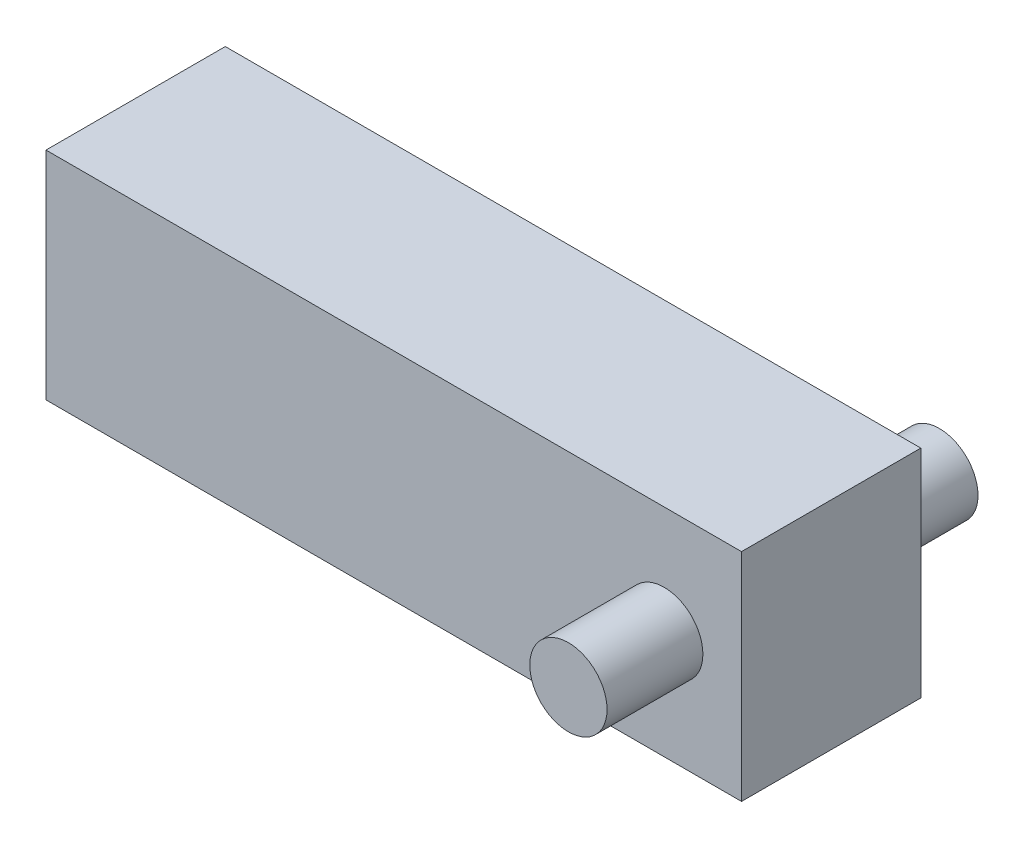
ISO-10303-21;
HEADER;
FILE_DESCRIPTION(('STEP AP214'),'2;1');
FILE_NAME('part.step','',(''),(''),'','','');
FILE_SCHEMA(('AUTOMOTIVE_DESIGN { 1 0 10303 214 1 1 1 1 }'));
ENDSEC;
DATA;
#1=APPLICATION_CONTEXT('core data for automotive mechanical design processes');
#2=APPLICATION_PROTOCOL_DEFINITION('international standard','automotive_design',2000,#1);
#3=PRODUCT_CONTEXT('',#1,'mechanical');
#4=PRODUCT('Part','Part','',(#3));
#5=PRODUCT_RELATED_PRODUCT_CATEGORY('part','',(#4));
#6=PRODUCT_DEFINITION_FORMATION('','',#4);
#7=PRODUCT_DEFINITION_CONTEXT('part definition',#1,'design');
#8=PRODUCT_DEFINITION('design','',#6,#7);
#9=PRODUCT_DEFINITION_SHAPE('','',#8);
#10=(LENGTH_UNIT() NAMED_UNIT(*) SI_UNIT(.MILLI.,.METRE.));
#11=(NAMED_UNIT(*) PLANE_ANGLE_UNIT() SI_UNIT($,.RADIAN.));
#12=(NAMED_UNIT(*) SI_UNIT($,.STERADIAN.) SOLID_ANGLE_UNIT());
#13=UNCERTAINTY_MEASURE_WITH_UNIT(LENGTH_MEASURE(1.E-05),#10,'distance_accuracy_value','');
#14=(GEOMETRIC_REPRESENTATION_CONTEXT(3) GLOBAL_UNCERTAINTY_ASSIGNED_CONTEXT((#13)) GLOBAL_UNIT_ASSIGNED_CONTEXT((#10,
#11,#12)) REPRESENTATION_CONTEXT('',''));
#15=CARTESIAN_POINT('',(0.,0.,0.));
#16=DIRECTION('',(0.,0.,1.));
#17=DIRECTION('',(1.,0.,0.));
#18=AXIS2_PLACEMENT_3D('',#15,#16,#17);
#19=CARTESIAN_POINT('',(-12.7,-4.445,-3.683));
#20=DIRECTION('',(-1.,0.,0.));
#21=DIRECTION('',(0.,0.,1.));
#22=AXIS2_PLACEMENT_3D('',#19,#20,#21);
#23=PLANE('',#22);
#24=DIRECTION('',(0.,0.,1.));
#25=VECTOR('',#24,1.);
#26=CARTESIAN_POINT('',(-12.7,-4.445,-3.683));
#27=LINE('',#26,#25);
#28=CARTESIAN_POINT('',(-12.7,-4.445,-3.683));
#29=VERTEX_POINT('',#28);
#30=CARTESIAN_POINT('',(-12.7,-4.445,3.683));
#31=VERTEX_POINT('',#30);
#32=EDGE_CURVE('E73',#29,#31,#27,.T.);
#33=ORIENTED_EDGE('',*,*,#32,.T.);
#34=DIRECTION('',(0.,-1.,0.));
#35=VECTOR('',#34,1.);
#36=CARTESIAN_POINT('',(-12.7,-4.445,3.683));
#37=LINE('',#36,#35);
#38=CARTESIAN_POINT('',(-12.7,4.445,3.683));
#39=VERTEX_POINT('',#38);
#40=EDGE_CURVE('E76',#39,#31,#37,.T.);
#41=ORIENTED_EDGE('',*,*,#40,.F.);
#42=DIRECTION('',(0.,0.,1.));
#43=VECTOR('',#42,1.);
#44=CARTESIAN_POINT('',(-12.7,4.445,-3.683));
#45=LINE('',#44,#43);
#46=CARTESIAN_POINT('',(-12.7,4.445,-3.683));
#47=VERTEX_POINT('',#46);
#48=EDGE_CURVE('E41',#47,#39,#45,.T.);
#49=ORIENTED_EDGE('',*,*,#48,.F.);
#50=DIRECTION('',(0.,-1.,0.));
#51=VECTOR('',#50,1.);
#52=CARTESIAN_POINT('',(-12.7,-4.445,-3.683));
#53=LINE('',#52,#51);
#54=EDGE_CURVE('E78',#47,#29,#53,.T.);
#55=ORIENTED_EDGE('',*,*,#54,.T.);
#56=EDGE_LOOP('',(#33,#41,#49,#55));
#57=FACE_BOUND('',#56,.T.);
#58=ADVANCED_FACE('F33',(#57),#23,.T.);
#59=CARTESIAN_POINT('',(-12.7,4.445,-3.683));
#60=DIRECTION('',(0.,1.,0.));
#61=DIRECTION('',(0.,0.,1.));
#62=AXIS2_PLACEMENT_3D('',#59,#60,#61);
#63=PLANE('',#62);
#64=ORIENTED_EDGE('',*,*,#48,.T.);
#65=DIRECTION('',(-1.,0.,0.));
#66=VECTOR('',#65,1.);
#67=CARTESIAN_POINT('',(12.7,4.445,3.683));
#68=LINE('',#67,#66);
#69=CARTESIAN_POINT('',(15.875,4.445,3.683));
#70=VERTEX_POINT('',#69);
#71=EDGE_CURVE('E93',#70,#39,#68,.T.);
#72=ORIENTED_EDGE('',*,*,#71,.F.);
#73=DIRECTION('',(0.,0.,1.));
#74=VECTOR('',#73,1.);
#75=CARTESIAN_POINT('',(15.875,4.445,-3.683));
#76=LINE('',#75,#74);
#77=CARTESIAN_POINT('',(15.875,4.445,-3.683));
#78=VERTEX_POINT('',#77);
#79=EDGE_CURVE('E54',#78,#70,#76,.T.);
#80=ORIENTED_EDGE('',*,*,#79,.F.);
#81=DIRECTION('',(-1.,0.,0.));
#82=VECTOR('',#81,1.);
#83=CARTESIAN_POINT('',(12.7,4.445,-3.683));
#84=LINE('',#83,#82);
#85=EDGE_CURVE('E49',#78,#47,#84,.T.);
#86=ORIENTED_EDGE('',*,*,#85,.T.);
#87=EDGE_LOOP('',(#64,#72,#80,#86));
#88=FACE_BOUND('',#87,.T.);
#89=ADVANCED_FACE('F113',(#88),#63,.T.);
#90=CARTESIAN_POINT('',(15.875,4.445,-3.683));
#91=DIRECTION('',(1.,0.,0.));
#92=DIRECTION('',(0.,0.,-1.));
#93=AXIS2_PLACEMENT_3D('',#90,#91,#92);
#94=PLANE('',#93);
#95=ORIENTED_EDGE('',*,*,#79,.T.);
#96=DIRECTION('',(0.,1.,0.));
#97=VECTOR('',#96,1.);
#98=CARTESIAN_POINT('',(15.875,4.445,3.683));
#99=LINE('',#98,#97);
#100=CARTESIAN_POINT('',(15.875,-4.445,3.683));
#101=VERTEX_POINT('',#100);
#102=EDGE_CURVE('E89',#101,#70,#99,.T.);
#103=ORIENTED_EDGE('',*,*,#102,.F.);
#104=DIRECTION('',(0.,0.,1.));
#105=VECTOR('',#104,1.);
#106=CARTESIAN_POINT('',(15.875,-4.445,-3.683));
#107=LINE('',#106,#105);
#108=CARTESIAN_POINT('',(15.875,-4.445,-3.683));
#109=VERTEX_POINT('',#108);
#110=EDGE_CURVE('E81',#109,#101,#107,.T.);
#111=ORIENTED_EDGE('',*,*,#110,.F.);
#112=DIRECTION('',(0.,1.,0.));
#113=VECTOR('',#112,1.);
#114=CARTESIAN_POINT('',(15.875,4.445,-3.683));
#115=LINE('',#114,#113);
#116=EDGE_CURVE('E104',#109,#78,#115,.T.);
#117=ORIENTED_EDGE('',*,*,#116,.T.);
#118=EDGE_LOOP('',(#95,#103,#111,#117));
#119=FACE_BOUND('',#118,.T.);
#120=ADVANCED_FACE('F111',(#119),#94,.T.);
#121=CARTESIAN_POINT('',(15.875,-4.445,-3.683));
#122=DIRECTION('',(0.,-1.,0.));
#123=DIRECTION('',(0.,0.,-1.));
#124=AXIS2_PLACEMENT_3D('',#121,#122,#123);
#125=PLANE('',#124);
#126=ORIENTED_EDGE('',*,*,#110,.T.);
#127=DIRECTION('',(1.,0.,0.));
#128=VECTOR('',#127,1.);
#129=CARTESIAN_POINT('',(12.7,-4.445,3.683));
#130=LINE('',#129,#128);
#131=EDGE_CURVE('E83',#31,#101,#130,.T.);
#132=ORIENTED_EDGE('',*,*,#131,.F.);
#133=ORIENTED_EDGE('',*,*,#32,.F.);
#134=DIRECTION('',(1.,0.,0.));
#135=VECTOR('',#134,1.);
#136=CARTESIAN_POINT('',(12.7,-4.445,-3.683));
#137=LINE('',#136,#135);
#138=EDGE_CURVE('E102',#29,#109,#137,.T.);
#139=ORIENTED_EDGE('',*,*,#138,.T.);
#140=EDGE_LOOP('',(#126,#132,#133,#139));
#141=FACE_BOUND('',#140,.T.);
#142=ADVANCED_FACE('F84',(#141),#125,.T.);
#143=CARTESIAN_POINT('',(-12.7,4.445,-3.683));
#144=DIRECTION('',(0.,0.,-1.));
#145=DIRECTION('',(-1.,0.,0.));
#146=AXIS2_PLACEMENT_3D('',#143,#144,#145);
#147=PLANE('',#146);
#148=CARTESIAN_POINT('',(12.7,0.,-3.683));
#149=DIRECTION('',(0.,0.,-1.));
#150=DIRECTION('',(-1.,0.,0.));
#151=AXIS2_PLACEMENT_3D('',#148,#149,#150);
#152=CIRCLE('',#151,1.5875);
#153=CARTESIAN_POINT('',(14.2875,0.,-3.683));
#154=VERTEX_POINT('',#153);
#155=EDGE_CURVE('E11',#154,#154,#152,.T.);
#156=ORIENTED_EDGE('',*,*,#155,.F.);
#157=EDGE_LOOP('',(#156));
#158=FACE_BOUND('',#157,.T.);
#159=ORIENTED_EDGE('',*,*,#54,.F.);
#160=ORIENTED_EDGE('',*,*,#85,.F.);
#161=ORIENTED_EDGE('',*,*,#116,.F.);
#162=ORIENTED_EDGE('',*,*,#138,.F.);
#163=EDGE_LOOP('',(#159,#160,#161,#162));
#164=FACE_BOUND('',#163,.T.);
#165=ADVANCED_FACE('F115',(#158,#164),#147,.T.);
#166=CARTESIAN_POINT('',(-12.7,4.445,3.683));
#167=DIRECTION('',(0.,0.,-1.));
#168=DIRECTION('',(-1.,0.,0.));
#169=AXIS2_PLACEMENT_3D('',#166,#167,#168);
#170=PLANE('',#169);
#171=CARTESIAN_POINT('',(12.7,0.,3.683));
#172=DIRECTION('',(0.,0.,-1.));
#173=DIRECTION('',(-1.,0.,0.));
#174=AXIS2_PLACEMENT_3D('',#171,#172,#173);
#175=CIRCLE('',#174,1.5875);
#176=CARTESIAN_POINT('',(14.2875,0.,3.683));
#177=VERTEX_POINT('',#176);
#178=EDGE_CURVE('E36',#177,#177,#175,.T.);
#179=ORIENTED_EDGE('',*,*,#178,.T.);
#180=EDGE_LOOP('',(#179));
#181=FACE_BOUND('',#180,.T.);
#182=ORIENTED_EDGE('',*,*,#40,.T.);
#183=ORIENTED_EDGE('',*,*,#131,.T.);
#184=ORIENTED_EDGE('',*,*,#102,.T.);
#185=ORIENTED_EDGE('',*,*,#71,.T.);
#186=EDGE_LOOP('',(#182,#183,#184,#185));
#187=FACE_BOUND('',#186,.T.);
#188=ADVANCED_FACE('F92',(#181,#187),#170,.F.);
#189=CARTESIAN_POINT('',(12.7,0.,7.62));
#190=DIRECTION('',(0.,0.,1.));
#191=DIRECTION('',(1.,0.,0.));
#192=AXIS2_PLACEMENT_3D('',#189,#190,#191);
#193=PLANE('',#192);
#194=CARTESIAN_POINT('',(12.7,0.,7.62));
#195=DIRECTION('',(0.,0.,1.));
#196=DIRECTION('',(1.,0.,0.));
#197=AXIS2_PLACEMENT_3D('',#194,#195,#196);
#198=CIRCLE('',#197,1.5875);
#199=CARTESIAN_POINT('',(14.2875,0.,7.62));
#200=VERTEX_POINT('',#199);
#201=EDGE_CURVE('E198',#200,#200,#198,.T.);
#202=ORIENTED_EDGE('',*,*,#201,.T.);
#203=EDGE_LOOP('',(#202));
#204=FACE_BOUND('',#203,.T.);
#205=ADVANCED_FACE('F123',(#204),#193,.T.);
#206=CARTESIAN_POINT('',(12.7,0.,-7.62));
#207=DIRECTION('',(0.,0.,1.));
#208=DIRECTION('',(1.,0.,0.));
#209=AXIS2_PLACEMENT_3D('',#206,#207,#208);
#210=CYLINDRICAL_SURFACE('',#209,1.5875);
#211=CARTESIAN_POINT('',(14.2875,0.,7.62));
#212=CARTESIAN_POINT('',(14.2875,0.,7.57898958333333));
#213=CARTESIAN_POINT('',(14.2875,0.,7.53797916666667));
#214=CARTESIAN_POINT('',(14.2875,0.,7.45595833333333));
#215=CARTESIAN_POINT('',(14.2875,0.,7.41494791666667));
#216=CARTESIAN_POINT('',(14.2875,0.,7.33292708333333));
#217=CARTESIAN_POINT('',(14.2875,0.,7.29191666666667));
#218=CARTESIAN_POINT('',(14.2875,0.,7.20989583333333));
#219=CARTESIAN_POINT('',(14.2875,0.,7.16888541666667));
#220=CARTESIAN_POINT('',(14.2875,0.,7.08686458333333));
#221=CARTESIAN_POINT('',(14.2875,0.,7.04585416666667));
#222=CARTESIAN_POINT('',(14.2875,0.,6.96383333333333));
#223=CARTESIAN_POINT('',(14.2875,0.,6.92282291666667));
#224=CARTESIAN_POINT('',(14.2875,0.,6.84080208333333));
#225=CARTESIAN_POINT('',(14.2875,0.,6.79979166666667));
#226=CARTESIAN_POINT('',(14.2875,0.,6.71777083333333));
#227=CARTESIAN_POINT('',(14.2875,0.,6.67676041666667));
#228=CARTESIAN_POINT('',(14.2875,0.,6.59473958333333));
#229=CARTESIAN_POINT('',(14.2875,0.,6.55372916666667));
#230=CARTESIAN_POINT('',(14.2875,0.,6.47170833333333));
#231=CARTESIAN_POINT('',(14.2875,0.,6.43069791666667));
#232=CARTESIAN_POINT('',(14.2875,0.,6.34867708333333));
#233=CARTESIAN_POINT('',(14.2875,0.,6.30766666666667));
#234=CARTESIAN_POINT('',(14.2875,0.,6.22564583333333));
#235=CARTESIAN_POINT('',(14.2875,0.,6.18463541666667));
#236=CARTESIAN_POINT('',(14.2875,0.,6.10261458333333));
#237=CARTESIAN_POINT('',(14.2875,0.,6.06160416666667));
#238=CARTESIAN_POINT('',(14.2875,0.,5.97958333333333));
#239=CARTESIAN_POINT('',(14.2875,0.,5.93857291666667));
#240=CARTESIAN_POINT('',(14.2875,0.,5.85655208333333));
#241=CARTESIAN_POINT('',(14.2875,0.,5.81554166666667));
#242=CARTESIAN_POINT('',(14.2875,0.,5.73352083333333));
#243=CARTESIAN_POINT('',(14.2875,0.,5.69251041666667));
#244=CARTESIAN_POINT('',(14.2875,0.,5.61048958333333));
#245=CARTESIAN_POINT('',(14.2875,0.,5.56947916666667));
#246=CARTESIAN_POINT('',(14.2875,0.,5.48745833333333));
#247=CARTESIAN_POINT('',(14.2875,0.,5.44644791666667));
#248=CARTESIAN_POINT('',(14.2875,0.,5.36442708333333));
#249=CARTESIAN_POINT('',(14.2875,0.,5.32341666666667));
#250=CARTESIAN_POINT('',(14.2875,0.,5.24139583333333));
#251=CARTESIAN_POINT('',(14.2875,0.,5.20038541666667));
#252=CARTESIAN_POINT('',(14.2875,0.,5.11836458333333));
#253=CARTESIAN_POINT('',(14.2875,0.,5.07735416666667));
#254=CARTESIAN_POINT('',(14.2875,0.,4.99533333333333));
#255=CARTESIAN_POINT('',(14.2875,0.,4.95432291666667));
#256=CARTESIAN_POINT('',(14.2875,0.,4.87230208333333));
#257=CARTESIAN_POINT('',(14.2875,0.,4.83129166666667));
#258=CARTESIAN_POINT('',(14.2875,0.,4.74927083333333));
#259=CARTESIAN_POINT('',(14.2875,0.,4.70826041666666));
#260=CARTESIAN_POINT('',(14.2875,0.,4.62623958333333));
#261=CARTESIAN_POINT('',(14.2875,0.,4.58522916666667));
#262=CARTESIAN_POINT('',(14.2875,0.,4.50320833333333));
#263=CARTESIAN_POINT('',(14.2875,0.,4.46219791666667));
#264=CARTESIAN_POINT('',(14.2875,0.,4.38017708333333));
#265=CARTESIAN_POINT('',(14.2875,0.,4.33916666666667));
#266=CARTESIAN_POINT('',(14.2875,0.,4.25714583333333));
#267=CARTESIAN_POINT('',(14.2875,0.,4.21613541666667));
#268=CARTESIAN_POINT('',(14.2875,0.,4.13411458333333));
#269=CARTESIAN_POINT('',(14.2875,0.,4.09310416666667));
#270=CARTESIAN_POINT('',(14.2875,0.,4.01108333333333));
#271=CARTESIAN_POINT('',(14.2875,0.,3.97007291666667));
#272=CARTESIAN_POINT('',(14.2875,0.,3.88805208333333));
#273=CARTESIAN_POINT('',(14.2875,0.,3.84704166666667));
#274=CARTESIAN_POINT('',(14.2875,0.,3.76502083333333));
#275=CARTESIAN_POINT('',(14.2875,0.,3.72401041666667));
#276=CARTESIAN_POINT('',(14.2875,0.,3.683));
#277=B_SPLINE_CURVE_WITH_KNOTS('',3,(#211,#212,#213,#214,#215,#216,#217,#218,#219,#220,#221,
#222,#223,#224,#225,#226,#227,#228,#229,#230,#231,#232,#233,#234,#235,#236,#237,#238,#239,#240,
#241,#242,#243,#244,#245,#246,#247,#248,#249,#250,#251,#252,#253,#254,#255,#256,#257,#258,#259,
#260,#261,#262,#263,#264,#265,#266,#267,#268,#269,#270,#271,#272,#273,#274,#275,#276),
.UNSPECIFIED.,.F.,.F.,(4,2,2,2,2,2,2,2,2,2,2,2,2,2,2,2,2,2,2,2,2,2,2,2,2,2,2,2,2,2,2,2,4),(0.,
0.123031250000001,0.2460625,0.36909375,0.492124999999999,0.61515625,0.738187499999999,
0.86121875,0.984249999999999,1.10728125,1.2303125,1.35334375,1.476375,1.59940625,1.7224375,
1.84546875,1.9685,2.09153125,2.2145625,2.33759375,2.460625,2.58365625,2.7066875,2.82971875,
2.95275,3.07578125,3.1988125,3.32184375,3.444875,3.56790625,3.6909375,3.81396875,3.937),.UNSPECIFIED.);
#278=EDGE_CURVE('BSEAM162',#200,#177,#277,.T.);
#279=ORIENTED_EDGE('',*,*,#201,.F.);
#280=ORIENTED_EDGE('',*,*,#178,.F.);
#281=ORIENTED_EDGE('',*,*,#278,.T.);
#282=ORIENTED_EDGE('',*,*,#278,.F.);
#283=EDGE_LOOP('',(#279,#281,#280,#282));
#284=FACE_BOUND('',#283,.T.);
#285=ADVANCED_FACE('F162',(#284),#210,.T.);
#286=CARTESIAN_POINT('',(12.7,0.,-7.62));
#287=DIRECTION('',(0.,0.,1.));
#288=DIRECTION('',(1.,0.,0.));
#289=AXIS2_PLACEMENT_3D('',#286,#287,#288);
#290=CIRCLE('',#289,1.5875);
#291=CARTESIAN_POINT('',(14.2875,0.,-7.62));
#292=VERTEX_POINT('',#291);
#293=EDGE_CURVE('E96',#292,#292,#290,.T.);
#294=CARTESIAN_POINT('',(14.2875,0.,-3.683));
#295=CARTESIAN_POINT('',(14.2875,0.,-3.72401041666667));
#296=CARTESIAN_POINT('',(14.2875,0.,-3.76502083333333));
#297=CARTESIAN_POINT('',(14.2875,0.,-3.84704166666666));
#298=CARTESIAN_POINT('',(14.2875,0.,-3.88805208333333));
#299=CARTESIAN_POINT('',(14.2875,0.,-3.97007291666667));
#300=CARTESIAN_POINT('',(14.2875,0.,-4.01108333333333));
#301=CARTESIAN_POINT('',(14.2875,0.,-4.09310416666666));
#302=CARTESIAN_POINT('',(14.2875,0.,-4.13411458333333));
#303=CARTESIAN_POINT('',(14.2875,0.,-4.21613541666667));
#304=CARTESIAN_POINT('',(14.2875,0.,-4.25714583333333));
#305=CARTESIAN_POINT('',(14.2875,0.,-4.33916666666667));
#306=CARTESIAN_POINT('',(14.2875,0.,-4.38017708333333));
#307=CARTESIAN_POINT('',(14.2875,0.,-4.46219791666666));
#308=CARTESIAN_POINT('',(14.2875,0.,-4.50320833333333));
#309=CARTESIAN_POINT('',(14.2875,0.,-4.58522916666667));
#310=CARTESIAN_POINT('',(14.2875,0.,-4.62623958333333));
#311=CARTESIAN_POINT('',(14.2875,0.,-4.70826041666666));
#312=CARTESIAN_POINT('',(14.2875,0.,-4.74927083333333));
#313=CARTESIAN_POINT('',(14.2875,0.,-4.83129166666667));
#314=CARTESIAN_POINT('',(14.2875,0.,-4.87230208333333));
#315=CARTESIAN_POINT('',(14.2875,0.,-4.95432291666667));
#316=CARTESIAN_POINT('',(14.2875,0.,-4.99533333333333));
#317=CARTESIAN_POINT('',(14.2875,0.,-5.07735416666667));
#318=CARTESIAN_POINT('',(14.2875,0.,-5.11836458333333));
#319=CARTESIAN_POINT('',(14.2875,0.,-5.20038541666667));
#320=CARTESIAN_POINT('',(14.2875,0.,-5.24139583333333));
#321=CARTESIAN_POINT('',(14.2875,0.,-5.32341666666667));
#322=CARTESIAN_POINT('',(14.2875,0.,-5.36442708333333));
#323=CARTESIAN_POINT('',(14.2875,0.,-5.44644791666667));
#324=CARTESIAN_POINT('',(14.2875,0.,-5.48745833333333));
#325=CARTESIAN_POINT('',(14.2875,0.,-5.56947916666667));
#326=CARTESIAN_POINT('',(14.2875,0.,-5.61048958333333));
#327=CARTESIAN_POINT('',(14.2875,0.,-5.69251041666667));
#328=CARTESIAN_POINT('',(14.2875,0.,-5.73352083333333));
#329=CARTESIAN_POINT('',(14.2875,0.,-5.81554166666666));
#330=CARTESIAN_POINT('',(14.2875,0.,-5.85655208333333));
#331=CARTESIAN_POINT('',(14.2875,0.,-5.93857291666667));
#332=CARTESIAN_POINT('',(14.2875,0.,-5.97958333333333));
#333=CARTESIAN_POINT('',(14.2875,0.,-6.06160416666667));
#334=CARTESIAN_POINT('',(14.2875,0.,-6.10261458333333));
#335=CARTESIAN_POINT('',(14.2875,0.,-6.18463541666667));
#336=CARTESIAN_POINT('',(14.2875,0.,-6.22564583333333));
#337=CARTESIAN_POINT('',(14.2875,0.,-6.30766666666667));
#338=CARTESIAN_POINT('',(14.2875,0.,-6.34867708333333));
#339=CARTESIAN_POINT('',(14.2875,0.,-6.43069791666667));
#340=CARTESIAN_POINT('',(14.2875,0.,-6.47170833333333));
#341=CARTESIAN_POINT('',(14.2875,0.,-6.55372916666667));
#342=CARTESIAN_POINT('',(14.2875,0.,-6.59473958333333));
#343=CARTESIAN_POINT('',(14.2875,0.,-6.67676041666667));
#344=CARTESIAN_POINT('',(14.2875,0.,-6.71777083333333));
#345=CARTESIAN_POINT('',(14.2875,0.,-6.79979166666667));
#346=CARTESIAN_POINT('',(14.2875,0.,-6.84080208333333));
#347=CARTESIAN_POINT('',(14.2875,0.,-6.92282291666667));
#348=CARTESIAN_POINT('',(14.2875,0.,-6.96383333333333));
#349=CARTESIAN_POINT('',(14.2875,0.,-7.04585416666667));
#350=CARTESIAN_POINT('',(14.2875,0.,-7.08686458333333));
#351=CARTESIAN_POINT('',(14.2875,0.,-7.16888541666667));
#352=CARTESIAN_POINT('',(14.2875,0.,-7.20989583333333));
#353=CARTESIAN_POINT('',(14.2875,0.,-7.29191666666667));
#354=CARTESIAN_POINT('',(14.2875,0.,-7.33292708333333));
#355=CARTESIAN_POINT('',(14.2875,0.,-7.41494791666667));
#356=CARTESIAN_POINT('',(14.2875,0.,-7.45595833333333));
#357=CARTESIAN_POINT('',(14.2875,0.,-7.53797916666667));
#358=CARTESIAN_POINT('',(14.2875,0.,-7.57898958333333));
#359=CARTESIAN_POINT('',(14.2875,0.,-7.62));
#360=B_SPLINE_CURVE_WITH_KNOTS('',3,(#294,#295,#296,#297,#298,#299,#300,#301,#302,#303,#304,
#305,#306,#307,#308,#309,#310,#311,#312,#313,#314,#315,#316,#317,#318,#319,#320,#321,#322,#323,
#324,#325,#326,#327,#328,#329,#330,#331,#332,#333,#334,#335,#336,#337,#338,#339,#340,#341,#342,
#343,#344,#345,#346,#347,#348,#349,#350,#351,#352,#353,#354,#355,#356,#357,#358,#359),
.UNSPECIFIED.,.F.,.F.,(4,2,2,2,2,2,2,2,2,2,2,2,2,2,2,2,2,2,2,2,2,2,2,2,2,2,2,2,2,2,2,2,4),(0.,
0.123031249999999,0.2460625,0.36909375,0.492124999999999,0.61515625,0.738187499999999,
0.86121875,0.98425,1.10728125,1.2303125,1.35334375,1.476375,1.59940625,1.7224375,1.84546875,
1.9685,2.09153125,2.2145625,2.33759375,2.460625,2.58365625,2.7066875,2.82971875,2.95275,
3.07578125,3.1988125,3.32184375,3.444875,3.56790625,3.6909375,3.81396875,3.937),.UNSPECIFIED.);
#361=EDGE_CURVE('BSEAM172',#154,#292,#360,.T.);
#362=ORIENTED_EDGE('',*,*,#155,.T.);
#363=ORIENTED_EDGE('',*,*,#293,.T.);
#364=ORIENTED_EDGE('',*,*,#361,.T.);
#365=ORIENTED_EDGE('',*,*,#361,.F.);
#366=EDGE_LOOP('',(#362,#364,#363,#365));
#367=FACE_BOUND('',#366,.T.);
#368=ADVANCED_FACE('F172',(#367),#210,.T.);
#369=CARTESIAN_POINT('',(12.7,0.,-7.62));
#370=DIRECTION('',(0.,0.,1.));
#371=DIRECTION('',(1.,0.,0.));
#372=AXIS2_PLACEMENT_3D('',#369,#370,#371);
#373=PLANE('',#372);
#374=ORIENTED_EDGE('',*,*,#293,.F.);
#375=EDGE_LOOP('',(#374));
#376=FACE_BOUND('',#375,.T.);
#377=ADVANCED_FACE('F182',(#376),#373,.F.);
#378=CLOSED_SHELL('',(#58,#89,#120,#142,#165,#188,#205,#285,#368,#377));
#379=MANIFOLD_SOLID_BREP('B2',#378);
#380=ADVANCED_BREP_SHAPE_REPRESENTATION('',(#18,#379),#14);
#381=SHAPE_DEFINITION_REPRESENTATION(#9,#380);
ENDSEC;
END-ISO-10303-21;
